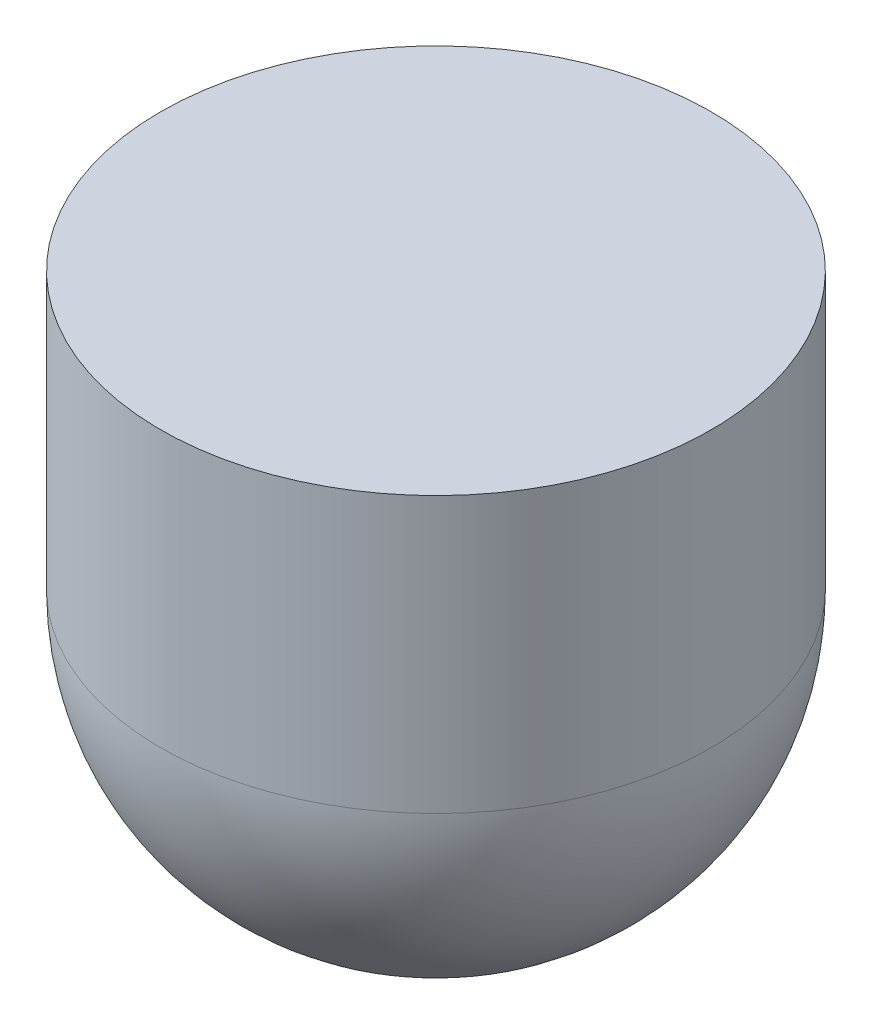
ISO-10303-21;
HEADER;
FILE_DESCRIPTION(('STEP AP214'),'2;1');
FILE_NAME('part.step','',(''),(''),'','','');
FILE_SCHEMA(('AUTOMOTIVE_DESIGN { 1 0 10303 214 1 1 1 1 }'));
ENDSEC;
DATA;
#1=APPLICATION_CONTEXT('core data for automotive mechanical design processes');
#2=APPLICATION_PROTOCOL_DEFINITION('international standard','automotive_design',2000,#1);
#3=PRODUCT_CONTEXT('',#1,'mechanical');
#4=PRODUCT('Part','Part','',(#3));
#5=PRODUCT_RELATED_PRODUCT_CATEGORY('part','',(#4));
#6=PRODUCT_DEFINITION_FORMATION('','',#4);
#7=PRODUCT_DEFINITION_CONTEXT('part definition',#1,'design');
#8=PRODUCT_DEFINITION('design','',#6,#7);
#9=PRODUCT_DEFINITION_SHAPE('','',#8);
#10=(LENGTH_UNIT() NAMED_UNIT(*) SI_UNIT(.MILLI.,.METRE.));
#11=(NAMED_UNIT(*) PLANE_ANGLE_UNIT() SI_UNIT($,.RADIAN.));
#12=(NAMED_UNIT(*) SI_UNIT($,.STERADIAN.) SOLID_ANGLE_UNIT());
#13=UNCERTAINTY_MEASURE_WITH_UNIT(LENGTH_MEASURE(1.E-05),#10,'distance_accuracy_value','');
#14=(GEOMETRIC_REPRESENTATION_CONTEXT(3) GLOBAL_UNCERTAINTY_ASSIGNED_CONTEXT((#13)) GLOBAL_UNIT_ASSIGNED_CONTEXT((#10,
#11,#12)) REPRESENTATION_CONTEXT('',''));
#15=CARTESIAN_POINT('',(0.,0.,0.));
#16=DIRECTION('',(0.,0.,1.));
#17=DIRECTION('',(1.,0.,0.));
#18=AXIS2_PLACEMENT_3D('',#15,#16,#17);
#19=CARTESIAN_POINT('',(0.,10.5,0.));
#20=DIRECTION('',(0.,1.,0.));
#21=DIRECTION('',(-1.,0.,0.));
#22=AXIS2_PLACEMENT_3D('',#19,#20,#21);
#23=PLANE('',#22);
#24=CARTESIAN_POINT('',(0.,10.5,0.));
#25=DIRECTION('',(0.,1.,0.));
#26=DIRECTION('',(-1.,0.,0.));
#27=AXIS2_PLACEMENT_3D('',#24,#25,#26);
#28=CIRCLE('',#27,5.25);
#29=CARTESIAN_POINT('',(-5.25,10.5,0.));
#30=VERTEX_POINT('',#29);
#31=EDGE_CURVE('E10',#30,#30,#28,.T.);
#32=ORIENTED_EDGE('',*,*,#31,.T.);
#33=EDGE_LOOP('',(#32));
#34=FACE_BOUND('',#33,.T.);
#35=ADVANCED_FACE('F16',(#34),#23,.T.);
#36=CARTESIAN_POINT('',(0.,5.25,0.));
#37=DIRECTION('',(0.,1.,0.));
#38=DIRECTION('',(-1.,0.,0.));
#39=AXIS2_PLACEMENT_3D('',#36,#37,#38);
#40=CYLINDRICAL_SURFACE('',#39,5.25);
#41=ORIENTED_EDGE('',*,*,#31,.F.);
#42=EDGE_LOOP('',(#41));
#43=FACE_BOUND('',#42,.T.);
#44=CARTESIAN_POINT('',(0.,5.25,0.));
#45=DIRECTION('',(0.,1.,0.));
#46=DIRECTION('',(-1.,0.,0.));
#47=AXIS2_PLACEMENT_3D('',#44,#45,#46);
#48=CIRCLE('',#47,5.25);
#49=CARTESIAN_POINT('',(-5.25,5.25,0.));
#50=VERTEX_POINT('',#49);
#51=EDGE_CURVE('E23',#50,#50,#48,.T.);
#52=ORIENTED_EDGE('',*,*,#51,.T.);
#53=EDGE_LOOP('',(#52));
#54=FACE_BOUND('',#53,.T.);
#55=ADVANCED_FACE('F32',(#43,#54),#40,.T.);
#56=CARTESIAN_POINT('',(0.,5.25,0.));
#57=DIRECTION('',(0.,1.,0.));
#58=DIRECTION('',(-1.,0.,0.));
#59=AXIS2_PLACEMENT_3D('',#56,#57,#58);
#60=SPHERICAL_SURFACE('',#59,5.25);
#61=ORIENTED_EDGE('',*,*,#51,.F.);
#62=EDGE_LOOP('',(#61));
#63=FACE_BOUND('',#62,.T.);
#64=ADVANCED_FACE('F30',(#63),#60,.T.);
#65=CLOSED_SHELL('',(#35,#55,#64));
#66=MANIFOLD_SOLID_BREP('B1',#65);
#67=ADVANCED_BREP_SHAPE_REPRESENTATION('',(#18,#66),#14);
#68=SHAPE_DEFINITION_REPRESENTATION(#9,#67);
ENDSEC;
END-ISO-10303-21;
